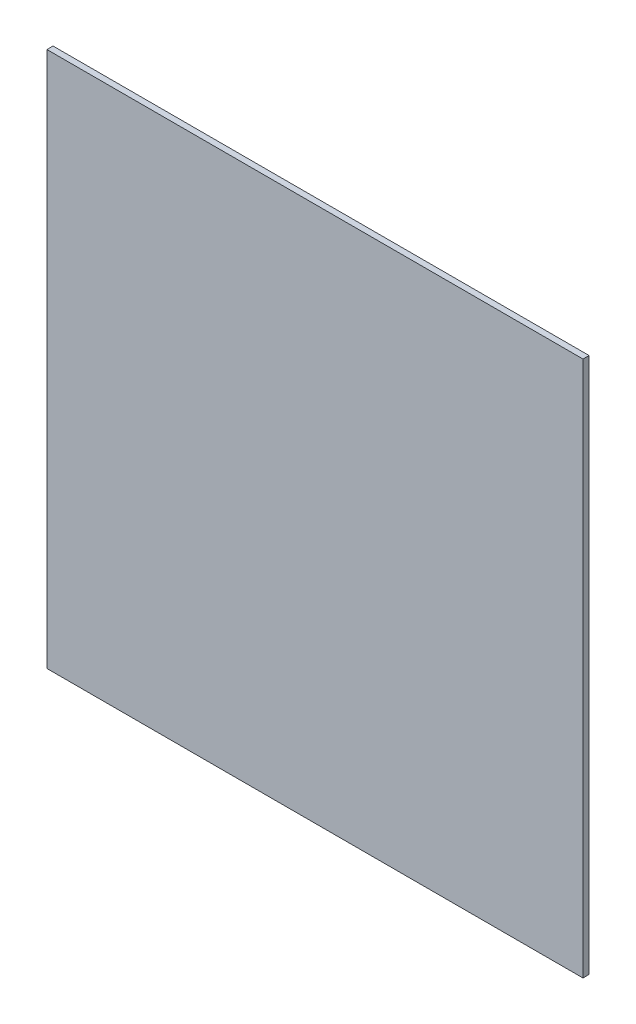
ISO-10303-21;
HEADER;
FILE_DESCRIPTION(('STEP AP214'),'2;1');
FILE_NAME('part.step','',(''),(''),'','','');
FILE_SCHEMA(('AUTOMOTIVE_DESIGN { 1 0 10303 214 1 1 1 1 }'));
ENDSEC;
DATA;
#1=APPLICATION_CONTEXT('core data for automotive mechanical design processes');
#2=APPLICATION_PROTOCOL_DEFINITION('international standard','automotive_design',2000,#1);
#3=PRODUCT_CONTEXT('',#1,'mechanical');
#4=PRODUCT('Part','Part','',(#3));
#5=PRODUCT_RELATED_PRODUCT_CATEGORY('part','',(#4));
#6=PRODUCT_DEFINITION_FORMATION('','',#4);
#7=PRODUCT_DEFINITION_CONTEXT('part definition',#1,'design');
#8=PRODUCT_DEFINITION('design','',#6,#7);
#9=PRODUCT_DEFINITION_SHAPE('','',#8);
#10=(LENGTH_UNIT() NAMED_UNIT(*) SI_UNIT(.MILLI.,.METRE.));
#11=(NAMED_UNIT(*) PLANE_ANGLE_UNIT() SI_UNIT($,.RADIAN.));
#12=(NAMED_UNIT(*) SI_UNIT($,.STERADIAN.) SOLID_ANGLE_UNIT());
#13=UNCERTAINTY_MEASURE_WITH_UNIT(LENGTH_MEASURE(1.E-05),#10,'distance_accuracy_value','');
#14=(GEOMETRIC_REPRESENTATION_CONTEXT(3) GLOBAL_UNCERTAINTY_ASSIGNED_CONTEXT((#13)) GLOBAL_UNIT_ASSIGNED_CONTEXT((#10,
#11,#12)) REPRESENTATION_CONTEXT('',''));
#15=CARTESIAN_POINT('',(0.,0.,0.));
#16=DIRECTION('',(0.,0.,1.));
#17=DIRECTION('',(1.,0.,0.));
#18=AXIS2_PLACEMENT_3D('',#15,#16,#17);
#19=CARTESIAN_POINT('',(-220.,220.,5.));
#20=DIRECTION('',(1.,0.,0.));
#21=DIRECTION('',(0.,0.,-1.));
#22=AXIS2_PLACEMENT_3D('',#19,#20,#21);
#23=PLANE('',#22);
#24=DIRECTION('',(0.,-1.,0.));
#25=VECTOR('',#24,1.);
#26=CARTESIAN_POINT('',(-220.,220.,0.));
#27=LINE('',#26,#25);
#28=CARTESIAN_POINT('',(-220.,220.,0.));
#29=VERTEX_POINT('',#28);
#30=CARTESIAN_POINT('',(-220.,-220.,0.));
#31=VERTEX_POINT('',#30);
#32=EDGE_CURVE('E94',#29,#31,#27,.T.);
#33=ORIENTED_EDGE('',*,*,#32,.T.);
#34=DIRECTION('',(0.,0.,-1.));
#35=VECTOR('',#34,1.);
#36=CARTESIAN_POINT('',(-220.,-220.,5.));
#37=LINE('',#36,#35);
#38=CARTESIAN_POINT('',(-220.,-220.,5.));
#39=VERTEX_POINT('',#38);
#40=EDGE_CURVE('E11',#39,#31,#37,.T.);
#41=ORIENTED_EDGE('',*,*,#40,.F.);
#42=DIRECTION('',(0.,-1.,0.));
#43=VECTOR('',#42,1.);
#44=CARTESIAN_POINT('',(-220.,220.,5.));
#45=LINE('',#44,#43);
#46=CARTESIAN_POINT('',(-220.,220.,5.));
#47=VERTEX_POINT('',#46);
#48=EDGE_CURVE('E82',#47,#39,#45,.T.);
#49=ORIENTED_EDGE('',*,*,#48,.F.);
#50=DIRECTION('',(0.,0.,-1.));
#51=VECTOR('',#50,1.);
#52=CARTESIAN_POINT('',(-220.,220.,5.));
#53=LINE('',#52,#51);
#54=EDGE_CURVE('E90',#47,#29,#53,.T.);
#55=ORIENTED_EDGE('',*,*,#54,.T.);
#56=EDGE_LOOP('',(#33,#41,#49,#55));
#57=FACE_BOUND('',#56,.T.);
#58=ADVANCED_FACE('F31',(#57),#23,.F.);
#59=CARTESIAN_POINT('',(-220.,-220.,5.));
#60=DIRECTION('',(0.,1.,0.));
#61=DIRECTION('',(0.,0.,1.));
#62=AXIS2_PLACEMENT_3D('',#59,#60,#61);
#63=PLANE('',#62);
#64=DIRECTION('',(1.,0.,0.));
#65=VECTOR('',#64,1.);
#66=CARTESIAN_POINT('',(-220.,-220.,0.));
#67=LINE('',#66,#65);
#68=CARTESIAN_POINT('',(220.,-220.,0.));
#69=VERTEX_POINT('',#68);
#70=EDGE_CURVE('E86',#31,#69,#67,.T.);
#71=ORIENTED_EDGE('',*,*,#70,.T.);
#72=DIRECTION('',(0.,0.,-1.));
#73=VECTOR('',#72,1.);
#74=CARTESIAN_POINT('',(220.,-220.,5.));
#75=LINE('',#74,#73);
#76=CARTESIAN_POINT('',(220.,-220.,5.));
#77=VERTEX_POINT('',#76);
#78=EDGE_CURVE('E39',#77,#69,#75,.T.);
#79=ORIENTED_EDGE('',*,*,#78,.F.);
#80=DIRECTION('',(1.,0.,0.));
#81=VECTOR('',#80,1.);
#82=CARTESIAN_POINT('',(-220.,-220.,5.));
#83=LINE('',#82,#81);
#84=EDGE_CURVE('E77',#39,#77,#83,.T.);
#85=ORIENTED_EDGE('',*,*,#84,.F.);
#86=ORIENTED_EDGE('',*,*,#40,.T.);
#87=EDGE_LOOP('',(#71,#79,#85,#86));
#88=FACE_BOUND('',#87,.T.);
#89=ADVANCED_FACE('F85',(#88),#63,.F.);
#90=CARTESIAN_POINT('',(220.,220.,5.));
#91=DIRECTION('',(-1.,0.,0.));
#92=DIRECTION('',(0.,0.,1.));
#93=AXIS2_PLACEMENT_3D('',#90,#91,#92);
#94=PLANE('',#93);
#95=DIRECTION('',(0.,1.,0.));
#96=VECTOR('',#95,1.);
#97=CARTESIAN_POINT('',(220.,220.,0.));
#98=LINE('',#97,#96);
#99=CARTESIAN_POINT('',(220.,220.,0.));
#100=VERTEX_POINT('',#99);
#101=EDGE_CURVE('E64',#69,#100,#98,.T.);
#102=ORIENTED_EDGE('',*,*,#101,.T.);
#103=DIRECTION('',(0.,0.,-1.));
#104=VECTOR('',#103,1.);
#105=CARTESIAN_POINT('',(220.,220.,5.));
#106=LINE('',#105,#104);
#107=CARTESIAN_POINT('',(220.,220.,5.));
#108=VERTEX_POINT('',#107);
#109=EDGE_CURVE('E87',#108,#100,#106,.T.);
#110=ORIENTED_EDGE('',*,*,#109,.F.);
#111=DIRECTION('',(0.,1.,0.));
#112=VECTOR('',#111,1.);
#113=CARTESIAN_POINT('',(220.,220.,5.));
#114=LINE('',#113,#112);
#115=EDGE_CURVE('E80',#77,#108,#114,.T.);
#116=ORIENTED_EDGE('',*,*,#115,.F.);
#117=ORIENTED_EDGE('',*,*,#78,.T.);
#118=EDGE_LOOP('',(#102,#110,#116,#117));
#119=FACE_BOUND('',#118,.T.);
#120=ADVANCED_FACE('F88',(#119),#94,.F.);
#121=CARTESIAN_POINT('',(-220.,220.,5.));
#122=DIRECTION('',(0.,-1.,0.));
#123=DIRECTION('',(0.,0.,-1.));
#124=AXIS2_PLACEMENT_3D('',#121,#122,#123);
#125=PLANE('',#124);
#126=DIRECTION('',(-1.,0.,0.));
#127=VECTOR('',#126,1.);
#128=CARTESIAN_POINT('',(-220.,220.,0.));
#129=LINE('',#128,#127);
#130=EDGE_CURVE('E70',#100,#29,#129,.T.);
#131=ORIENTED_EDGE('',*,*,#130,.T.);
#132=ORIENTED_EDGE('',*,*,#54,.F.);
#133=DIRECTION('',(-1.,0.,0.));
#134=VECTOR('',#133,1.);
#135=CARTESIAN_POINT('',(-220.,220.,5.));
#136=LINE('',#135,#134);
#137=EDGE_CURVE('E47',#108,#47,#136,.T.);
#138=ORIENTED_EDGE('',*,*,#137,.F.);
#139=ORIENTED_EDGE('',*,*,#109,.T.);
#140=EDGE_LOOP('',(#131,#132,#138,#139));
#141=FACE_BOUND('',#140,.T.);
#142=ADVANCED_FACE('F101',(#141),#125,.F.);
#143=CARTESIAN_POINT('',(-220.,-220.,5.));
#144=DIRECTION('',(0.,0.,1.));
#145=DIRECTION('',(1.,0.,0.));
#146=AXIS2_PLACEMENT_3D('',#143,#144,#145);
#147=PLANE('',#146);
#148=ORIENTED_EDGE('',*,*,#48,.T.);
#149=ORIENTED_EDGE('',*,*,#84,.T.);
#150=ORIENTED_EDGE('',*,*,#115,.T.);
#151=ORIENTED_EDGE('',*,*,#137,.T.);
#152=EDGE_LOOP('',(#148,#149,#150,#151));
#153=FACE_BOUND('',#152,.T.);
#154=ADVANCED_FACE('F78',(#153),#147,.T.);
#155=CARTESIAN_POINT('',(-220.,-220.,0.));
#156=DIRECTION('',(0.,0.,1.));
#157=DIRECTION('',(1.,0.,0.));
#158=AXIS2_PLACEMENT_3D('',#155,#156,#157);
#159=PLANE('',#158);
#160=ORIENTED_EDGE('',*,*,#32,.F.);
#161=ORIENTED_EDGE('',*,*,#130,.F.);
#162=ORIENTED_EDGE('',*,*,#101,.F.);
#163=ORIENTED_EDGE('',*,*,#70,.F.);
#164=EDGE_LOOP('',(#160,#161,#162,#163));
#165=FACE_BOUND('',#164,.T.);
#166=ADVANCED_FACE('F104',(#165),#159,.F.);
#167=CLOSED_SHELL('',(#58,#89,#120,#142,#154,#166));
#168=MANIFOLD_SOLID_BREP('B2',#167);
#169=ADVANCED_BREP_SHAPE_REPRESENTATION('',(#18,#168),#14);
#170=SHAPE_DEFINITION_REPRESENTATION(#9,#169);
ENDSEC;
END-ISO-10303-21;
